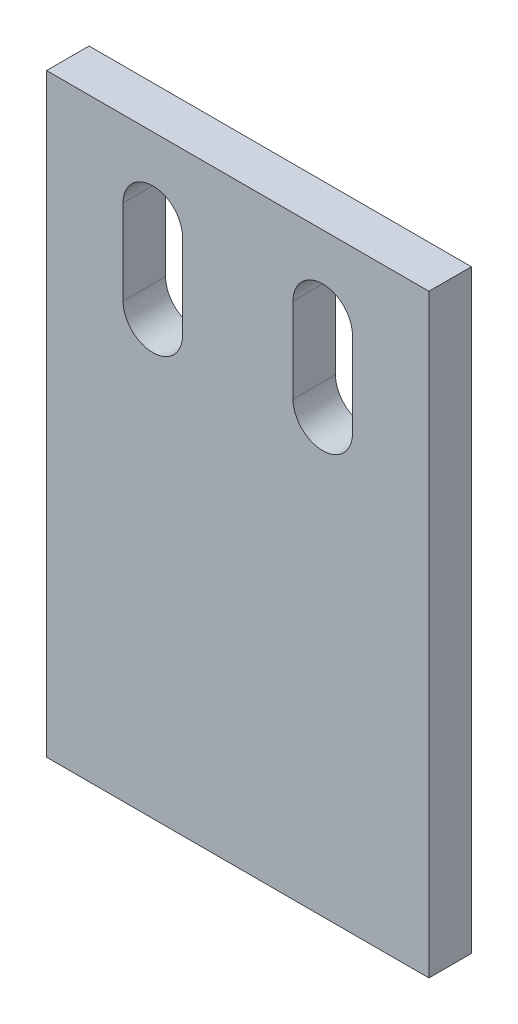
ISO-10303-21;
HEADER;
FILE_DESCRIPTION(('STEP AP214'),'2;1');
FILE_NAME('part.step','',(''),(''),'','','');
FILE_SCHEMA(('AUTOMOTIVE_DESIGN { 1 0 10303 214 1 1 1 1 }'));
ENDSEC;
DATA;
#1=APPLICATION_CONTEXT('core data for automotive mechanical design processes');
#2=APPLICATION_PROTOCOL_DEFINITION('international standard','automotive_design',2000,#1);
#3=PRODUCT_CONTEXT('',#1,'mechanical');
#4=PRODUCT('Part','Part','',(#3));
#5=PRODUCT_RELATED_PRODUCT_CATEGORY('part','',(#4));
#6=PRODUCT_DEFINITION_FORMATION('','',#4);
#7=PRODUCT_DEFINITION_CONTEXT('part definition',#1,'design');
#8=PRODUCT_DEFINITION('design','',#6,#7);
#9=PRODUCT_DEFINITION_SHAPE('','',#8);
#10=(LENGTH_UNIT() NAMED_UNIT(*) SI_UNIT(.MILLI.,.METRE.));
#11=(NAMED_UNIT(*) PLANE_ANGLE_UNIT() SI_UNIT($,.RADIAN.));
#12=(NAMED_UNIT(*) SI_UNIT($,.STERADIAN.) SOLID_ANGLE_UNIT());
#13=UNCERTAINTY_MEASURE_WITH_UNIT(LENGTH_MEASURE(1.E-05),#10,'distance_accuracy_value','');
#14=(GEOMETRIC_REPRESENTATION_CONTEXT(3) GLOBAL_UNCERTAINTY_ASSIGNED_CONTEXT((#13)) GLOBAL_UNIT_ASSIGNED_CONTEXT((#10,
#11,#12)) REPRESENTATION_CONTEXT('',''));
#15=CARTESIAN_POINT('',(0.,0.,0.));
#16=DIRECTION('',(0.,0.,1.));
#17=DIRECTION('',(1.,0.,0.));
#18=AXIS2_PLACEMENT_3D('',#15,#16,#17);
#19=CARTESIAN_POINT('',(0.,-140.,-10.));
#20=DIRECTION('',(-1.,0.,0.));
#21=DIRECTION('',(0.,0.,1.));
#22=AXIS2_PLACEMENT_3D('',#19,#20,#21);
#23=PLANE('',#22);
#24=DIRECTION('',(0.,-1.,0.));
#25=VECTOR('',#24,1.);
#26=CARTESIAN_POINT('',(0.,-140.,0.));
#27=LINE('',#26,#25);
#28=CARTESIAN_POINT('',(0.,0.,0.));
#29=VERTEX_POINT('',#28);
#30=CARTESIAN_POINT('',(0.,-140.,0.));
#31=VERTEX_POINT('',#30);
#32=EDGE_CURVE('E189',#29,#31,#27,.T.);
#33=ORIENTED_EDGE('',*,*,#32,.F.);
#34=DIRECTION('',(0.,0.,1.));
#35=VECTOR('',#34,1.);
#36=CARTESIAN_POINT('',(0.,0.,-10.));
#37=LINE('',#36,#35);
#38=CARTESIAN_POINT('',(0.,0.,-10.));
#39=VERTEX_POINT('',#38);
#40=EDGE_CURVE('E11',#39,#29,#37,.T.);
#41=ORIENTED_EDGE('',*,*,#40,.F.);
#42=DIRECTION('',(0.,-1.,0.));
#43=VECTOR('',#42,1.);
#44=CARTESIAN_POINT('',(0.,-140.,-10.));
#45=LINE('',#44,#43);
#46=CARTESIAN_POINT('',(0.,-140.,-10.));
#47=VERTEX_POINT('',#46);
#48=EDGE_CURVE('E196',#39,#47,#45,.T.);
#49=ORIENTED_EDGE('',*,*,#48,.T.);
#50=DIRECTION('',(0.,0.,1.));
#51=VECTOR('',#50,1.);
#52=CARTESIAN_POINT('',(0.,-140.,-10.));
#53=LINE('',#52,#51);
#54=EDGE_CURVE('E41',#47,#31,#53,.T.);
#55=ORIENTED_EDGE('',*,*,#54,.T.);
#56=EDGE_LOOP('',(#33,#41,#49,#55));
#57=FACE_BOUND('',#56,.T.);
#58=ADVANCED_FACE('F38',(#57),#23,.T.);
#59=CARTESIAN_POINT('',(0.,0.,-10.));
#60=DIRECTION('',(0.,1.,0.));
#61=DIRECTION('',(0.,0.,1.));
#62=AXIS2_PLACEMENT_3D('',#59,#60,#61);
#63=PLANE('',#62);
#64=DIRECTION('',(-1.,0.,0.));
#65=VECTOR('',#64,1.);
#66=CARTESIAN_POINT('',(0.,0.,0.));
#67=LINE('',#66,#65);
#68=CARTESIAN_POINT('',(90.,0.,0.));
#69=VERTEX_POINT('',#68);
#70=EDGE_CURVE('E200',#69,#29,#67,.T.);
#71=ORIENTED_EDGE('',*,*,#70,.F.);
#72=DIRECTION('',(0.,0.,1.));
#73=VECTOR('',#72,1.);
#74=CARTESIAN_POINT('',(90.,0.,-10.));
#75=LINE('',#74,#73);
#76=CARTESIAN_POINT('',(90.,0.,-10.));
#77=VERTEX_POINT('',#76);
#78=EDGE_CURVE('E46',#77,#69,#75,.T.);
#79=ORIENTED_EDGE('',*,*,#78,.F.);
#80=DIRECTION('',(-1.,0.,0.));
#81=VECTOR('',#80,1.);
#82=CARTESIAN_POINT('',(0.,0.,-10.));
#83=LINE('',#82,#81);
#84=EDGE_CURVE('E206',#77,#39,#83,.T.);
#85=ORIENTED_EDGE('',*,*,#84,.T.);
#86=ORIENTED_EDGE('',*,*,#40,.T.);
#87=EDGE_LOOP('',(#71,#79,#85,#86));
#88=FACE_BOUND('',#87,.T.);
#89=ADVANCED_FACE('F232',(#88),#63,.T.);
#90=CARTESIAN_POINT('',(90.,0.,-10.));
#91=DIRECTION('',(1.,0.,0.));
#92=DIRECTION('',(0.,0.,-1.));
#93=AXIS2_PLACEMENT_3D('',#90,#91,#92);
#94=PLANE('',#93);
#95=DIRECTION('',(0.,1.,0.));
#96=VECTOR('',#95,1.);
#97=CARTESIAN_POINT('',(90.,0.,0.));
#98=LINE('',#97,#96);
#99=CARTESIAN_POINT('',(90.,-140.,0.));
#100=VERTEX_POINT('',#99);
#101=EDGE_CURVE('E214',#100,#69,#98,.T.);
#102=ORIENTED_EDGE('',*,*,#101,.F.);
#103=DIRECTION('',(0.,0.,1.));
#104=VECTOR('',#103,1.);
#105=CARTESIAN_POINT('',(90.,-140.,-10.));
#106=LINE('',#105,#104);
#107=CARTESIAN_POINT('',(90.,-140.,-10.));
#108=VERTEX_POINT('',#107);
#109=EDGE_CURVE('E219',#108,#100,#106,.T.);
#110=ORIENTED_EDGE('',*,*,#109,.F.);
#111=DIRECTION('',(0.,1.,0.));
#112=VECTOR('',#111,1.);
#113=CARTESIAN_POINT('',(90.,0.,-10.));
#114=LINE('',#113,#112);
#115=EDGE_CURVE('E203',#108,#77,#114,.T.);
#116=ORIENTED_EDGE('',*,*,#115,.T.);
#117=ORIENTED_EDGE('',*,*,#78,.T.);
#118=EDGE_LOOP('',(#102,#110,#116,#117));
#119=FACE_BOUND('',#118,.T.);
#120=ADVANCED_FACE('F237',(#119),#94,.T.);
#121=CARTESIAN_POINT('',(0.,-140.,-10.));
#122=DIRECTION('',(0.,-1.,0.));
#123=DIRECTION('',(0.,0.,-1.));
#124=AXIS2_PLACEMENT_3D('',#121,#122,#123);
#125=PLANE('',#124);
#126=DIRECTION('',(1.,0.,0.));
#127=VECTOR('',#126,1.);
#128=CARTESIAN_POINT('',(0.,-140.,0.));
#129=LINE('',#128,#127);
#130=EDGE_CURVE('E211',#31,#100,#129,.T.);
#131=ORIENTED_EDGE('',*,*,#130,.F.);
#132=ORIENTED_EDGE('',*,*,#54,.F.);
#133=DIRECTION('',(1.,0.,0.));
#134=VECTOR('',#133,1.);
#135=CARTESIAN_POINT('',(0.,-140.,-10.));
#136=LINE('',#135,#134);
#137=EDGE_CURVE('E199',#47,#108,#136,.T.);
#138=ORIENTED_EDGE('',*,*,#137,.T.);
#139=ORIENTED_EDGE('',*,*,#109,.T.);
#140=EDGE_LOOP('',(#131,#132,#138,#139));
#141=FACE_BOUND('',#140,.T.);
#142=ADVANCED_FACE('F227',(#141),#125,.T.);
#143=CARTESIAN_POINT('',(0.,0.,-10.));
#144=DIRECTION('',(0.,0.,-1.));
#145=DIRECTION('',(-1.,0.,0.));
#146=AXIS2_PLACEMENT_3D('',#143,#144,#145);
#147=PLANE('',#146);
#148=CARTESIAN_POINT('',(65.,-18.,-10.));
#149=DIRECTION('',(0.,0.,1.));
#150=DIRECTION('',(-1.,0.,0.));
#151=AXIS2_PLACEMENT_3D('',#148,#149,#150);
#152=CIRCLE('',#151,7.);
#153=CARTESIAN_POINT('',(72.,-18.,-10.));
#154=VERTEX_POINT('',#153);
#155=CARTESIAN_POINT('',(58.,-18.,-10.));
#156=VERTEX_POINT('',#155);
#157=EDGE_CURVE('E129',#154,#156,#152,.T.);
#158=ORIENTED_EDGE('',*,*,#157,.T.);
#159=DIRECTION('',(0.,-1.,0.));
#160=VECTOR('',#159,1.);
#161=CARTESIAN_POINT('',(58.,-18.,-10.));
#162=LINE('',#161,#160);
#163=CARTESIAN_POINT('',(58.,-38.,-10.));
#164=VERTEX_POINT('',#163);
#165=EDGE_CURVE('E138',#156,#164,#162,.T.);
#166=ORIENTED_EDGE('',*,*,#165,.T.);
#167=CARTESIAN_POINT('',(65.,-38.,-10.));
#168=DIRECTION('',(0.,0.,1.));
#169=DIRECTION('',(-1.,0.,0.));
#170=AXIS2_PLACEMENT_3D('',#167,#168,#169);
#171=CIRCLE('',#170,6.99999999999999);
#172=CARTESIAN_POINT('',(72.,-38.,-10.));
#173=VERTEX_POINT('',#172);
#174=EDGE_CURVE('E54',#164,#173,#171,.T.);
#175=ORIENTED_EDGE('',*,*,#174,.T.);
#176=DIRECTION('',(0.,1.,0.));
#177=VECTOR('',#176,1.);
#178=CARTESIAN_POINT('',(72.,-18.,-10.));
#179=LINE('',#178,#177);
#180=EDGE_CURVE('E135',#173,#154,#179,.T.);
#181=ORIENTED_EDGE('',*,*,#180,.T.);
#182=EDGE_LOOP('',(#158,#166,#175,#181));
#183=FACE_BOUND('',#182,.T.);
#184=CARTESIAN_POINT('',(25.,-18.,-10.));
#185=DIRECTION('',(0.,0.,1.));
#186=DIRECTION('',(1.,0.,0.));
#187=AXIS2_PLACEMENT_3D('',#184,#185,#186);
#188=CIRCLE('',#187,7.);
#189=CARTESIAN_POINT('',(32.,-18.,-10.));
#190=VERTEX_POINT('',#189);
#191=CARTESIAN_POINT('',(18.,-18.,-10.));
#192=VERTEX_POINT('',#191);
#193=EDGE_CURVE('E164',#190,#192,#188,.T.);
#194=ORIENTED_EDGE('',*,*,#193,.T.);
#195=DIRECTION('',(0.,-1.,0.));
#196=VECTOR('',#195,1.);
#197=CARTESIAN_POINT('',(18.,-18.,-10.));
#198=LINE('',#197,#196);
#199=CARTESIAN_POINT('',(18.,-38.,-10.));
#200=VERTEX_POINT('',#199);
#201=EDGE_CURVE('E167',#192,#200,#198,.T.);
#202=ORIENTED_EDGE('',*,*,#201,.T.);
#203=CARTESIAN_POINT('',(25.,-38.,-10.));
#204=DIRECTION('',(0.,0.,1.));
#205=DIRECTION('',(1.,0.,0.));
#206=AXIS2_PLACEMENT_3D('',#203,#204,#205);
#207=CIRCLE('',#206,7.);
#208=CARTESIAN_POINT('',(32.,-38.,-10.));
#209=VERTEX_POINT('',#208);
#210=EDGE_CURVE('E171',#200,#209,#207,.T.);
#211=ORIENTED_EDGE('',*,*,#210,.T.);
#212=DIRECTION('',(0.,1.,0.));
#213=VECTOR('',#212,1.);
#214=CARTESIAN_POINT('',(32.,-18.,-10.));
#215=LINE('',#214,#213);
#216=EDGE_CURVE('E174',#209,#190,#215,.T.);
#217=ORIENTED_EDGE('',*,*,#216,.T.);
#218=EDGE_LOOP('',(#194,#202,#211,#217));
#219=FACE_BOUND('',#218,.T.);
#220=ORIENTED_EDGE('',*,*,#48,.F.);
#221=ORIENTED_EDGE('',*,*,#84,.F.);
#222=ORIENTED_EDGE('',*,*,#115,.F.);
#223=ORIENTED_EDGE('',*,*,#137,.F.);
#224=EDGE_LOOP('',(#220,#221,#222,#223));
#225=FACE_BOUND('',#224,.T.);
#226=ADVANCED_FACE('F142',(#183,#219,#225),#147,.T.);
#227=CARTESIAN_POINT('',(0.,0.,0.));
#228=DIRECTION('',(0.,0.,-1.));
#229=DIRECTION('',(-1.,0.,0.));
#230=AXIS2_PLACEMENT_3D('',#227,#228,#229);
#231=PLANE('',#230);
#232=DIRECTION('',(0.,-1.,0.));
#233=VECTOR('',#232,1.);
#234=CARTESIAN_POINT('',(58.,-18.,0.));
#235=LINE('',#234,#233);
#236=CARTESIAN_POINT('',(58.,-18.,0.));
#237=VERTEX_POINT('',#236);
#238=CARTESIAN_POINT('',(58.,-38.,0.));
#239=VERTEX_POINT('',#238);
#240=EDGE_CURVE('E154',#237,#239,#235,.T.);
#241=ORIENTED_EDGE('',*,*,#240,.F.);
#242=CARTESIAN_POINT('',(65.,-18.,0.));
#243=DIRECTION('',(0.,0.,1.));
#244=DIRECTION('',(-1.,0.,0.));
#245=AXIS2_PLACEMENT_3D('',#242,#243,#244);
#246=CIRCLE('',#245,7.);
#247=CARTESIAN_POINT('',(72.,-18.,0.));
#248=VERTEX_POINT('',#247);
#249=EDGE_CURVE('E62',#248,#237,#246,.T.);
#250=ORIENTED_EDGE('',*,*,#249,.F.);
#251=DIRECTION('',(0.,1.,0.));
#252=VECTOR('',#251,1.);
#253=CARTESIAN_POINT('',(72.,-18.,0.));
#254=LINE('',#253,#252);
#255=CARTESIAN_POINT('',(72.,-38.,0.));
#256=VERTEX_POINT('',#255);
#257=EDGE_CURVE('E145',#256,#248,#254,.T.);
#258=ORIENTED_EDGE('',*,*,#257,.F.);
#259=CARTESIAN_POINT('',(65.,-38.,0.));
#260=DIRECTION('',(0.,0.,1.));
#261=DIRECTION('',(-1.,0.,0.));
#262=AXIS2_PLACEMENT_3D('',#259,#260,#261);
#263=CIRCLE('',#262,6.99999999999999);
#264=EDGE_CURVE('E148',#239,#256,#263,.T.);
#265=ORIENTED_EDGE('',*,*,#264,.F.);
#266=EDGE_LOOP('',(#241,#250,#258,#265));
#267=FACE_BOUND('',#266,.T.);
#268=DIRECTION('',(0.,-1.,0.));
#269=VECTOR('',#268,1.);
#270=CARTESIAN_POINT('',(18.,-18.,0.));
#271=LINE('',#270,#269);
#272=CARTESIAN_POINT('',(18.,-18.,0.));
#273=VERTEX_POINT('',#272);
#274=CARTESIAN_POINT('',(18.,-38.,0.));
#275=VERTEX_POINT('',#274);
#276=EDGE_CURVE('E179',#273,#275,#271,.T.);
#277=ORIENTED_EDGE('',*,*,#276,.F.);
#278=CARTESIAN_POINT('',(25.,-18.,0.));
#279=DIRECTION('',(0.,0.,1.));
#280=DIRECTION('',(1.,0.,0.));
#281=AXIS2_PLACEMENT_3D('',#278,#279,#280);
#282=CIRCLE('',#281,7.);
#283=CARTESIAN_POINT('',(32.,-18.,0.));
#284=VERTEX_POINT('',#283);
#285=EDGE_CURVE('E160',#284,#273,#282,.T.);
#286=ORIENTED_EDGE('',*,*,#285,.F.);
#287=DIRECTION('',(0.,1.,0.));
#288=VECTOR('',#287,1.);
#289=CARTESIAN_POINT('',(32.,-18.,0.));
#290=LINE('',#289,#288);
#291=CARTESIAN_POINT('',(32.,-38.,0.));
#292=VERTEX_POINT('',#291);
#293=EDGE_CURVE('E168',#292,#284,#290,.T.);
#294=ORIENTED_EDGE('',*,*,#293,.F.);
#295=CARTESIAN_POINT('',(25.,-38.,0.));
#296=DIRECTION('',(0.,0.,1.));
#297=DIRECTION('',(1.,0.,0.));
#298=AXIS2_PLACEMENT_3D('',#295,#296,#297);
#299=CIRCLE('',#298,7.);
#300=EDGE_CURVE('E182',#275,#292,#299,.T.);
#301=ORIENTED_EDGE('',*,*,#300,.F.);
#302=EDGE_LOOP('',(#277,#286,#294,#301));
#303=FACE_BOUND('',#302,.T.);
#304=ORIENTED_EDGE('',*,*,#32,.T.);
#305=ORIENTED_EDGE('',*,*,#130,.T.);
#306=ORIENTED_EDGE('',*,*,#101,.T.);
#307=ORIENTED_EDGE('',*,*,#70,.T.);
#308=EDGE_LOOP('',(#304,#305,#306,#307));
#309=FACE_BOUND('',#308,.T.);
#310=ADVANCED_FACE('F229',(#267,#303,#309),#231,.F.);
#311=CARTESIAN_POINT('',(25.,-18.,-10.));
#312=DIRECTION('',(0.,0.,1.));
#313=DIRECTION('',(1.,0.,0.));
#314=AXIS2_PLACEMENT_3D('',#311,#312,#313);
#315=CYLINDRICAL_SURFACE('',#314,7.);
#316=ORIENTED_EDGE('',*,*,#285,.T.);
#317=DIRECTION('',(0.,0.,1.));
#318=VECTOR('',#317,1.);
#319=CARTESIAN_POINT('',(18.,-18.,-10.));
#320=LINE('',#319,#318);
#321=EDGE_CURVE('E177',#192,#273,#320,.T.);
#322=ORIENTED_EDGE('',*,*,#321,.F.);
#323=ORIENTED_EDGE('',*,*,#193,.F.);
#324=DIRECTION('',(0.,0.,1.));
#325=VECTOR('',#324,1.);
#326=CARTESIAN_POINT('',(32.,-18.,-10.));
#327=LINE('',#326,#325);
#328=EDGE_CURVE('E187',#190,#284,#327,.T.);
#329=ORIENTED_EDGE('',*,*,#328,.T.);
#330=EDGE_LOOP('',(#316,#322,#323,#329));
#331=FACE_BOUND('',#330,.T.);
#332=ADVANCED_FACE('F283',(#331),#315,.F.);
#333=CARTESIAN_POINT('',(32.,-18.,-10.));
#334=DIRECTION('',(1.,0.,0.));
#335=DIRECTION('',(0.,1.,0.));
#336=AXIS2_PLACEMENT_3D('',#333,#334,#335);
#337=PLANE('',#336);
#338=ORIENTED_EDGE('',*,*,#293,.T.);
#339=ORIENTED_EDGE('',*,*,#328,.F.);
#340=ORIENTED_EDGE('',*,*,#216,.F.);
#341=DIRECTION('',(0.,0.,1.));
#342=VECTOR('',#341,1.);
#343=CARTESIAN_POINT('',(32.,-38.,-10.));
#344=LINE('',#343,#342);
#345=EDGE_CURVE('E190',#209,#292,#344,.T.);
#346=ORIENTED_EDGE('',*,*,#345,.T.);
#347=EDGE_LOOP('',(#338,#339,#340,#346));
#348=FACE_BOUND('',#347,.T.);
#349=ADVANCED_FACE('F294',(#348),#337,.F.);
#350=CARTESIAN_POINT('',(25.,-38.,-10.));
#351=DIRECTION('',(0.,0.,1.));
#352=DIRECTION('',(1.,0.,0.));
#353=AXIS2_PLACEMENT_3D('',#350,#351,#352);
#354=CYLINDRICAL_SURFACE('',#353,7.);
#355=ORIENTED_EDGE('',*,*,#300,.T.);
#356=ORIENTED_EDGE('',*,*,#345,.F.);
#357=ORIENTED_EDGE('',*,*,#210,.F.);
#358=DIRECTION('',(0.,0.,1.));
#359=VECTOR('',#358,1.);
#360=CARTESIAN_POINT('',(18.,-38.,-10.));
#361=LINE('',#360,#359);
#362=EDGE_CURVE('E192',#200,#275,#361,.T.);
#363=ORIENTED_EDGE('',*,*,#362,.T.);
#364=EDGE_LOOP('',(#355,#356,#357,#363));
#365=FACE_BOUND('',#364,.T.);
#366=ADVANCED_FACE('F305',(#365),#354,.F.);
#367=CARTESIAN_POINT('',(18.,-18.,-10.));
#368=DIRECTION('',(-1.,0.,0.));
#369=DIRECTION('',(0.,-1.,0.));
#370=AXIS2_PLACEMENT_3D('',#367,#368,#369);
#371=PLANE('',#370);
#372=ORIENTED_EDGE('',*,*,#276,.T.);
#373=ORIENTED_EDGE('',*,*,#362,.F.);
#374=ORIENTED_EDGE('',*,*,#201,.F.);
#375=ORIENTED_EDGE('',*,*,#321,.T.);
#376=EDGE_LOOP('',(#372,#373,#374,#375));
#377=FACE_BOUND('',#376,.T.);
#378=ADVANCED_FACE('F316',(#377),#371,.F.);
#379=CARTESIAN_POINT('',(65.,-18.,-10.));
#380=DIRECTION('',(0.,0.,1.));
#381=DIRECTION('',(1.,0.,0.));
#382=AXIS2_PLACEMENT_3D('',#379,#380,#381);
#383=CYLINDRICAL_SURFACE('',#382,7.);
#384=ORIENTED_EDGE('',*,*,#249,.T.);
#385=DIRECTION('',(0.,0.,1.));
#386=VECTOR('',#385,1.);
#387=CARTESIAN_POINT('',(58.,-18.,-10.));
#388=LINE('',#387,#386);
#389=EDGE_CURVE('E125',#156,#237,#388,.T.);
#390=ORIENTED_EDGE('',*,*,#389,.F.);
#391=ORIENTED_EDGE('',*,*,#157,.F.);
#392=DIRECTION('',(0.,0.,1.));
#393=VECTOR('',#392,1.);
#394=CARTESIAN_POINT('',(72.,-18.,-10.));
#395=LINE('',#394,#393);
#396=EDGE_CURVE('E158',#154,#248,#395,.T.);
#397=ORIENTED_EDGE('',*,*,#396,.T.);
#398=EDGE_LOOP('',(#384,#390,#391,#397));
#399=FACE_BOUND('',#398,.T.);
#400=ADVANCED_FACE('F127',(#399),#383,.F.);
#401=CARTESIAN_POINT('',(72.,-18.,-10.));
#402=DIRECTION('',(1.,0.,0.));
#403=DIRECTION('',(0.,0.,-1.));
#404=AXIS2_PLACEMENT_3D('',#401,#402,#403);
#405=PLANE('',#404);
#406=ORIENTED_EDGE('',*,*,#257,.T.);
#407=ORIENTED_EDGE('',*,*,#396,.F.);
#408=ORIENTED_EDGE('',*,*,#180,.F.);
#409=DIRECTION('',(0.,0.,1.));
#410=VECTOR('',#409,1.);
#411=CARTESIAN_POINT('',(72.,-38.,-10.));
#412=LINE('',#411,#410);
#413=EDGE_CURVE('E161',#173,#256,#412,.T.);
#414=ORIENTED_EDGE('',*,*,#413,.T.);
#415=EDGE_LOOP('',(#406,#407,#408,#414));
#416=FACE_BOUND('',#415,.T.);
#417=ADVANCED_FACE('F337',(#416),#405,.F.);
#418=CARTESIAN_POINT('',(65.,-38.,-10.));
#419=DIRECTION('',(0.,0.,1.));
#420=DIRECTION('',(1.,0.,0.));
#421=AXIS2_PLACEMENT_3D('',#418,#419,#420);
#422=CYLINDRICAL_SURFACE('',#421,6.99999999999999);
#423=ORIENTED_EDGE('',*,*,#264,.T.);
#424=ORIENTED_EDGE('',*,*,#413,.F.);
#425=ORIENTED_EDGE('',*,*,#174,.F.);
#426=DIRECTION('',(0.,0.,1.));
#427=VECTOR('',#426,1.);
#428=CARTESIAN_POINT('',(58.,-38.,-10.));
#429=LINE('',#428,#427);
#430=EDGE_CURVE('E134',#164,#239,#429,.T.);
#431=ORIENTED_EDGE('',*,*,#430,.T.);
#432=EDGE_LOOP('',(#423,#424,#425,#431));
#433=FACE_BOUND('',#432,.T.);
#434=ADVANCED_FACE('F347',(#433),#422,.F.);
#435=CARTESIAN_POINT('',(58.,-18.,-10.));
#436=DIRECTION('',(-1.,0.,0.));
#437=DIRECTION('',(0.,-1.,0.));
#438=AXIS2_PLACEMENT_3D('',#435,#436,#437);
#439=PLANE('',#438);
#440=ORIENTED_EDGE('',*,*,#240,.T.);
#441=ORIENTED_EDGE('',*,*,#430,.F.);
#442=ORIENTED_EDGE('',*,*,#165,.F.);
#443=ORIENTED_EDGE('',*,*,#389,.T.);
#444=EDGE_LOOP('',(#440,#441,#442,#443));
#445=FACE_BOUND('',#444,.T.);
#446=ADVANCED_FACE('F139',(#445),#439,.F.);
#447=CLOSED_SHELL('',(#58,#89,#120,#142,#226,#310,#332,#349,#366,#378,#400,#417,#434,#446));
#448=MANIFOLD_SOLID_BREP('B2',#447);
#449=ADVANCED_BREP_SHAPE_REPRESENTATION('',(#18,#448),#14);
#450=SHAPE_DEFINITION_REPRESENTATION(#9,#449);
ENDSEC;
END-ISO-10303-21;
